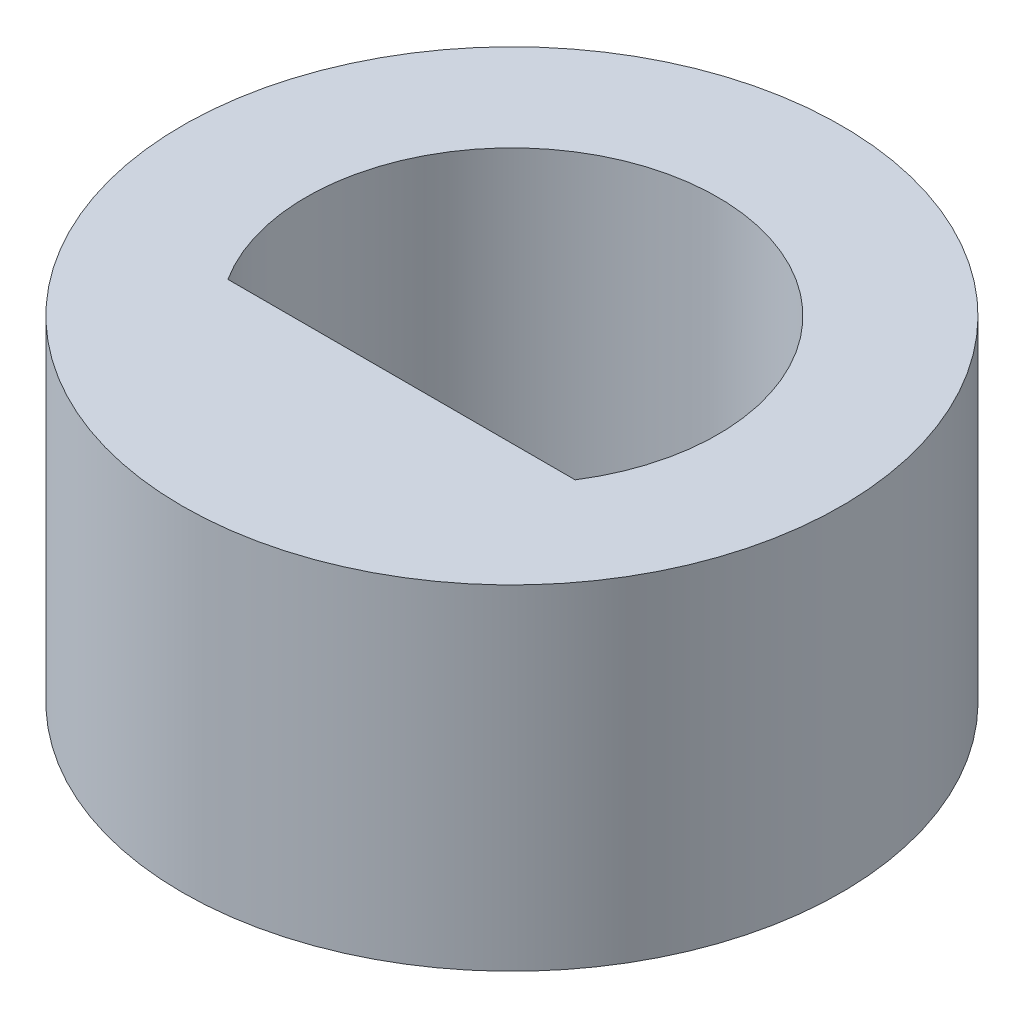
ISO-10303-21;
HEADER;
FILE_DESCRIPTION(('STEP AP214'),'2;1');
FILE_NAME('part.step','',(''),(''),'','','');
FILE_SCHEMA(('AUTOMOTIVE_DESIGN { 1 0 10303 214 1 1 1 1 }'));
ENDSEC;
DATA;
#1=APPLICATION_CONTEXT('core data for automotive mechanical design processes');
#2=APPLICATION_PROTOCOL_DEFINITION('international standard','automotive_design',2000,#1);
#3=PRODUCT_CONTEXT('',#1,'mechanical');
#4=PRODUCT('Part','Part','',(#3));
#5=PRODUCT_RELATED_PRODUCT_CATEGORY('part','',(#4));
#6=PRODUCT_DEFINITION_FORMATION('','',#4);
#7=PRODUCT_DEFINITION_CONTEXT('part definition',#1,'design');
#8=PRODUCT_DEFINITION('design','',#6,#7);
#9=PRODUCT_DEFINITION_SHAPE('','',#8);
#10=(LENGTH_UNIT() NAMED_UNIT(*) SI_UNIT(.MILLI.,.METRE.));
#11=(NAMED_UNIT(*) PLANE_ANGLE_UNIT() SI_UNIT($,.RADIAN.));
#12=(NAMED_UNIT(*) SI_UNIT($,.STERADIAN.) SOLID_ANGLE_UNIT());
#13=UNCERTAINTY_MEASURE_WITH_UNIT(LENGTH_MEASURE(1.E-05),#10,'distance_accuracy_value','');
#14=(GEOMETRIC_REPRESENTATION_CONTEXT(3) GLOBAL_UNCERTAINTY_ASSIGNED_CONTEXT((#13)) GLOBAL_UNIT_ASSIGNED_CONTEXT((#10,
#11,#12)) REPRESENTATION_CONTEXT('',''));
#15=CARTESIAN_POINT('',(0.,0.,0.));
#16=DIRECTION('',(0.,0.,1.));
#17=DIRECTION('',(1.,0.,0.));
#18=AXIS2_PLACEMENT_3D('',#15,#16,#17);
#19=CARTESIAN_POINT('',(0.,5.,0.));
#20=DIRECTION('',(0.,1.,0.));
#21=DIRECTION('',(0.,0.,1.));
#22=AXIS2_PLACEMENT_3D('',#19,#20,#21);
#23=PLANE('',#22);
#24=CARTESIAN_POINT('',(0.,5.,0.));
#25=DIRECTION('',(0.,1.,0.));
#26=DIRECTION('',(0.,0.,1.));
#27=AXIS2_PLACEMENT_3D('',#24,#25,#26);
#28=CIRCLE('',#27,4.925);
#29=CARTESIAN_POINT('',(0.,5.,4.925));
#30=VERTEX_POINT('',#29);
#31=EDGE_CURVE('E11',#30,#30,#28,.T.);
#32=ORIENTED_EDGE('',*,*,#31,.T.);
#33=EDGE_LOOP('',(#32));
#34=FACE_BOUND('',#33,.T.);
#35=DIRECTION('',(1.,0.,0.));
#36=VECTOR('',#35,1.);
#37=CARTESIAN_POINT('',(-2.59482658380093,5.,1.65));
#38=LINE('',#37,#36);
#39=CARTESIAN_POINT('',(-2.59482658380093,5.,1.65));
#40=VERTEX_POINT('',#39);
#41=CARTESIAN_POINT('',(2.59482658380093,5.,1.65));
#42=VERTEX_POINT('',#41);
#43=EDGE_CURVE('E84',#40,#42,#38,.T.);
#44=ORIENTED_EDGE('',*,*,#43,.F.);
#45=CARTESIAN_POINT('',(0.,5.,0.));
#46=DIRECTION('',(0.,1.,0.));
#47=DIRECTION('',(0.,0.,1.));
#48=AXIS2_PLACEMENT_3D('',#45,#46,#47);
#49=CIRCLE('',#48,3.075);
#50=EDGE_CURVE('E73',#42,#40,#49,.T.);
#51=ORIENTED_EDGE('',*,*,#50,.F.);
#52=EDGE_LOOP('',(#44,#51));
#53=FACE_BOUND('',#52,.T.);
#54=ADVANCED_FACE('F39',(#34,#53),#23,.T.);
#55=CARTESIAN_POINT('',(0.,0.,0.));
#56=DIRECTION('',(0.,1.,0.));
#57=DIRECTION('',(0.,0.,1.));
#58=AXIS2_PLACEMENT_3D('',#55,#56,#57);
#59=PLANE('',#58);
#60=CARTESIAN_POINT('',(0.,0.,0.));
#61=DIRECTION('',(0.,1.,0.));
#62=DIRECTION('',(0.,0.,1.));
#63=AXIS2_PLACEMENT_3D('',#60,#61,#62);
#64=CIRCLE('',#63,4.925);
#65=CARTESIAN_POINT('',(0.,0.,4.925));
#66=VERTEX_POINT('',#65);
#67=EDGE_CURVE('E43',#66,#66,#64,.T.);
#68=ORIENTED_EDGE('',*,*,#67,.F.);
#69=EDGE_LOOP('',(#68));
#70=FACE_BOUND('',#69,.T.);
#71=CARTESIAN_POINT('',(0.,0.,0.));
#72=DIRECTION('',(0.,1.,0.));
#73=DIRECTION('',(0.,0.,1.));
#74=AXIS2_PLACEMENT_3D('',#71,#72,#73);
#75=CIRCLE('',#74,3.075);
#76=CARTESIAN_POINT('',(2.59482658380093,0.,1.65));
#77=VERTEX_POINT('',#76);
#78=CARTESIAN_POINT('',(-2.59482658380093,0.,1.65));
#79=VERTEX_POINT('',#78);
#80=EDGE_CURVE('E62',#77,#79,#75,.T.);
#81=ORIENTED_EDGE('',*,*,#80,.T.);
#82=DIRECTION('',(1.,0.,0.));
#83=VECTOR('',#82,1.);
#84=CARTESIAN_POINT('',(-2.59482658380093,0.,1.65));
#85=LINE('',#84,#83);
#86=EDGE_CURVE('E68',#79,#77,#85,.T.);
#87=ORIENTED_EDGE('',*,*,#86,.T.);
#88=EDGE_LOOP('',(#81,#87));
#89=FACE_BOUND('',#88,.T.);
#90=ADVANCED_FACE('F80',(#70,#89),#59,.F.);
#91=CARTESIAN_POINT('',(0.,5.,0.));
#92=DIRECTION('',(0.,-1.,0.));
#93=DIRECTION('',(0.,0.,-1.));
#94=AXIS2_PLACEMENT_3D('',#91,#92,#93);
#95=CYLINDRICAL_SURFACE('',#94,4.925);
#96=ORIENTED_EDGE('',*,*,#31,.F.);
#97=EDGE_LOOP('',(#96));
#98=FACE_BOUND('',#97,.T.);
#99=ORIENTED_EDGE('',*,*,#67,.T.);
#100=EDGE_LOOP('',(#99));
#101=FACE_BOUND('',#100,.T.);
#102=ADVANCED_FACE('F41',(#98,#101),#95,.T.);
#103=CARTESIAN_POINT('',(0.,5.,0.));
#104=DIRECTION('',(0.,-1.,0.));
#105=DIRECTION('',(0.,0.,-1.));
#106=AXIS2_PLACEMENT_3D('',#103,#104,#105);
#107=CYLINDRICAL_SURFACE('',#106,3.075);
#108=ORIENTED_EDGE('',*,*,#80,.F.);
#109=DIRECTION('',(0.,-1.,0.));
#110=VECTOR('',#109,1.);
#111=CARTESIAN_POINT('',(2.59482658380093,5.,1.65));
#112=LINE('',#111,#110);
#113=EDGE_CURVE('E70',#42,#77,#112,.T.);
#114=ORIENTED_EDGE('',*,*,#113,.F.);
#115=ORIENTED_EDGE('',*,*,#50,.T.);
#116=DIRECTION('',(0.,-1.,0.));
#117=VECTOR('',#116,1.);
#118=CARTESIAN_POINT('',(-2.59482658380093,5.,1.65));
#119=LINE('',#118,#117);
#120=EDGE_CURVE('E55',#40,#79,#119,.T.);
#121=ORIENTED_EDGE('',*,*,#120,.T.);
#122=EDGE_LOOP('',(#108,#114,#115,#121));
#123=FACE_BOUND('',#122,.T.);
#124=ADVANCED_FACE('F75',(#123),#107,.F.);
#125=CARTESIAN_POINT('',(-2.59482658380093,5.,1.65));
#126=DIRECTION('',(0.,0.,-1.));
#127=DIRECTION('',(-1.,0.,0.));
#128=AXIS2_PLACEMENT_3D('',#125,#126,#127);
#129=PLANE('',#128);
#130=ORIENTED_EDGE('',*,*,#86,.F.);
#131=ORIENTED_EDGE('',*,*,#120,.F.);
#132=ORIENTED_EDGE('',*,*,#43,.T.);
#133=ORIENTED_EDGE('',*,*,#113,.T.);
#134=EDGE_LOOP('',(#130,#131,#132,#133));
#135=FACE_BOUND('',#134,.T.);
#136=ADVANCED_FACE('F69',(#135),#129,.T.);
#137=CLOSED_SHELL('',(#54,#90,#102,#124,#136));
#138=MANIFOLD_SOLID_BREP('B2',#137);
#139=ADVANCED_BREP_SHAPE_REPRESENTATION('',(#18,#138),#14);
#140=SHAPE_DEFINITION_REPRESENTATION(#9,#139);
ENDSEC;
END-ISO-10303-21;
